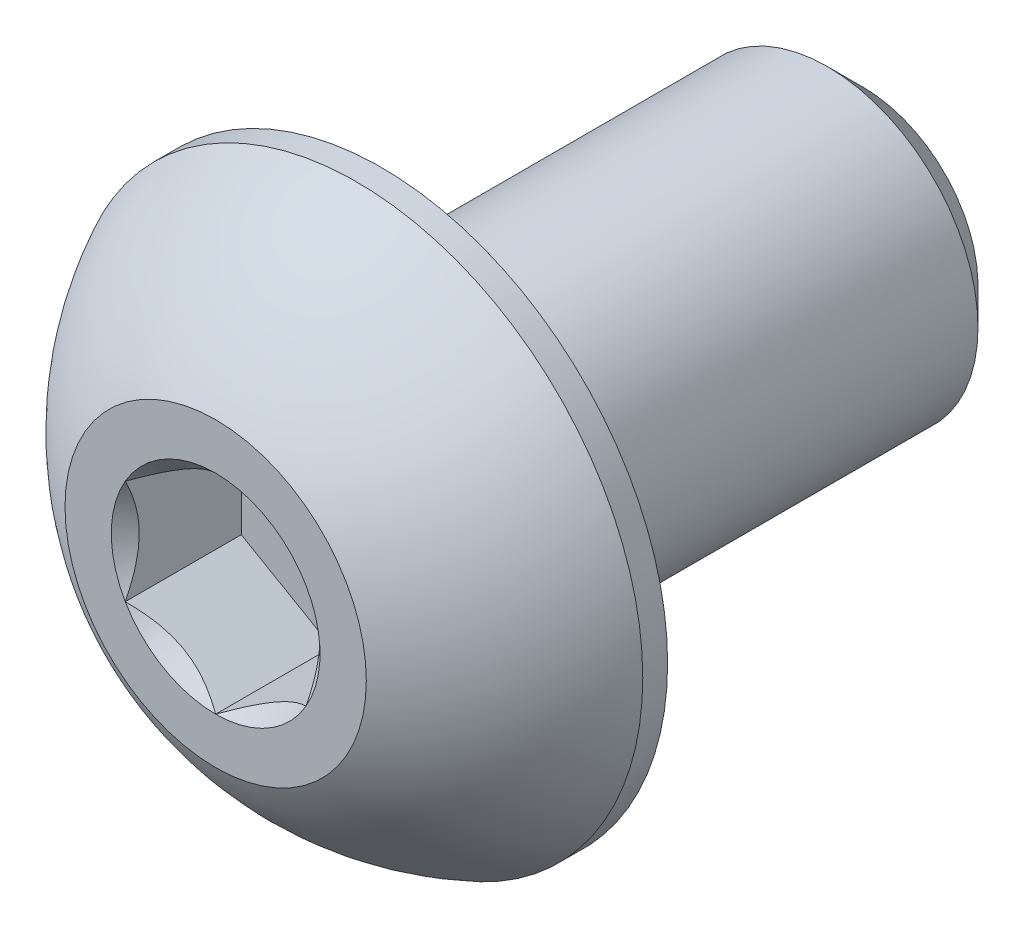
ISO-10303-21;
HEADER;
FILE_DESCRIPTION(('STEP AP214'),'2;1');
FILE_NAME('part.step','',(''),(''),'','','');
FILE_SCHEMA(('AUTOMOTIVE_DESIGN { 1 0 10303 214 1 1 1 1 }'));
ENDSEC;
DATA;
#1=APPLICATION_CONTEXT('core data for automotive mechanical design processes');
#2=APPLICATION_PROTOCOL_DEFINITION('international standard','automotive_design',2000,#1);
#3=PRODUCT_CONTEXT('',#1,'mechanical');
#4=PRODUCT('Part','Part','',(#3));
#5=PRODUCT_RELATED_PRODUCT_CATEGORY('part','',(#4));
#6=PRODUCT_DEFINITION_FORMATION('','',#4);
#7=PRODUCT_DEFINITION_CONTEXT('part definition',#1,'design');
#8=PRODUCT_DEFINITION('design','',#6,#7);
#9=PRODUCT_DEFINITION_SHAPE('','',#8);
#10=(LENGTH_UNIT() NAMED_UNIT(*) SI_UNIT(.MILLI.,.METRE.));
#11=(NAMED_UNIT(*) PLANE_ANGLE_UNIT() SI_UNIT($,.RADIAN.));
#12=(NAMED_UNIT(*) SI_UNIT($,.STERADIAN.) SOLID_ANGLE_UNIT());
#13=UNCERTAINTY_MEASURE_WITH_UNIT(LENGTH_MEASURE(1.E-05),#10,'distance_accuracy_value','');
#14=(GEOMETRIC_REPRESENTATION_CONTEXT(3) GLOBAL_UNCERTAINTY_ASSIGNED_CONTEXT((#13)) GLOBAL_UNIT_ASSIGNED_CONTEXT((#10,
#11,#12)) REPRESENTATION_CONTEXT('',''));
#15=CARTESIAN_POINT('',(0.,0.,0.));
#16=DIRECTION('',(0.,0.,1.));
#17=DIRECTION('',(1.,0.,0.));
#18=AXIS2_PLACEMENT_3D('',#15,#16,#17);
#19=CARTESIAN_POINT('',(0.,-2.50000000000001,-10.75));
#20=DIRECTION('',(0.,0.,-1.));
#21=DIRECTION('',(0.,1.,0.));
#22=AXIS2_PLACEMENT_3D('',#19,#20,#21);
#23=PLANE('',#22);
#24=CARTESIAN_POINT('',(0.,0.,-10.75));
#25=DIRECTION('',(0.,0.,-1.));
#26=DIRECTION('',(0.,1.,0.));
#27=AXIS2_PLACEMENT_3D('',#24,#25,#26);
#28=CIRCLE('',#27,1.90000000000001);
#29=CARTESIAN_POINT('',(0.,1.90000000000001,-10.75));
#30=VERTEX_POINT('',#29);
#31=EDGE_CURVE('E174',#30,#30,#28,.T.);
#32=ORIENTED_EDGE('',*,*,#31,.T.);
#33=EDGE_LOOP('',(#32));
#34=FACE_BOUND('',#33,.T.);
#35=ADVANCED_FACE('F34',(#34),#23,.T.);
#36=CARTESIAN_POINT('',(0.,0.,-10.75));
#37=DIRECTION('',(0.,0.,-1.));
#38=DIRECTION('',(0.,1.,0.));
#39=AXIS2_PLACEMENT_3D('',#36,#37,#38);
#40=CYLINDRICAL_SURFACE('',#39,2.5);
#41=CARTESIAN_POINT('',(0.,0.,-10.15));
#42=DIRECTION('',(0.,0.,-1.));
#43=DIRECTION('',(0.,1.,0.));
#44=AXIS2_PLACEMENT_3D('',#41,#42,#43);
#45=CIRCLE('',#44,2.5);
#46=CARTESIAN_POINT('',(0.,2.5,-10.15));
#47=VERTEX_POINT('',#46);
#48=EDGE_CURVE('E48',#47,#47,#45,.F.);
#49=ORIENTED_EDGE('',*,*,#48,.T.);
#50=EDGE_LOOP('',(#49));
#51=FACE_BOUND('',#50,.T.);
#52=CARTESIAN_POINT('',(0.,0.,-2.75));
#53=DIRECTION('',(0.,0.,1.));
#54=DIRECTION('',(1.,0.,0.));
#55=AXIS2_PLACEMENT_3D('',#52,#53,#54);
#56=CIRCLE('',#55,2.5);
#57=CARTESIAN_POINT('',(2.5,0.,-2.75));
#58=VERTEX_POINT('',#57);
#59=EDGE_CURVE('E171',#58,#58,#56,.F.);
#60=ORIENTED_EDGE('',*,*,#59,.T.);
#61=EDGE_LOOP('',(#60));
#62=FACE_BOUND('',#61,.T.);
#63=ADVANCED_FACE('F179',(#51,#62),#40,.T.);
#64=CARTESIAN_POINT('',(0.,0.,-10.75));
#65=DIRECTION('',(0.,0.,1.));
#66=DIRECTION('',(0.,-1.,0.));
#67=AXIS2_PLACEMENT_3D('',#64,#65,#66);
#68=CONICAL_SURFACE('',#67,1.90000000000001,0.785398163397447);
#69=ORIENTED_EDGE('',*,*,#48,.F.);
#70=EDGE_LOOP('',(#69));
#71=FACE_BOUND('',#70,.T.);
#72=ORIENTED_EDGE('',*,*,#31,.F.);
#73=EDGE_LOOP('',(#72));
#74=FACE_BOUND('',#73,.T.);
#75=ADVANCED_FACE('F36',(#71,#74),#68,.T.);
#76=CARTESIAN_POINT('',(0.,0.,-4.65805481283422));
#77=DIRECTION('',(0.,0.,1.));
#78=DIRECTION('',(0.,-1.,0.));
#79=AXIS2_PLACEMENT_3D('',#76,#77,#78);
#80=SPHERICAL_SURFACE('',#79,5.28653711226622);
#81=CARTESIAN_POINT('',(0.,0.,0.));
#82=DIRECTION('',(0.,0.,1.));
#83=DIRECTION('',(1.,0.,0.));
#84=AXIS2_PLACEMENT_3D('',#81,#82,#83);
#85=CIRCLE('',#84,2.5);
#86=CARTESIAN_POINT('',(0.,-2.50000000000001,0.));
#87=VERTEX_POINT('',#86);
#88=EDGE_CURVE('E168',#87,#87,#85,.T.);
#89=CARTESIAN_POINT('',(0.,0.,-2.3375));
#90=DIRECTION('',(0.,0.,1.));
#91=DIRECTION('',(1.,0.,0.));
#92=AXIS2_PLACEMENT_3D('',#89,#90,#91);
#93=CIRCLE('',#92,4.75);
#94=CARTESIAN_POINT('',(0.,-4.75,-2.3375));
#95=VERTEX_POINT('',#94);
#96=EDGE_CURVE('E162',#95,#95,#93,.T.);
#97=CARTESIAN_POINT('',(0.,-2.50000000000001,0.));
#98=CARTESIAN_POINT('',(0.,-2.53026679982018,-0.0162442824556099));
#99=CARTESIAN_POINT('',(0.,-2.56037522904968,-0.0327836412064137));
#100=CARTESIAN_POINT('',(0.,-2.62026400427658,-0.066446051882188));
#101=CARTESIAN_POINT('',(0.,-2.65004435027397,-0.0835691038071585));
#102=CARTESIAN_POINT('',(0.,-2.70926561698584,-0.118392441415041));
#103=CARTESIAN_POINT('',(0.,-2.73870653770033,-0.136092727097952));
#104=CARTESIAN_POINT('',(0.,-2.79723777417104,-0.172063794044946));
#105=CARTESIAN_POINT('',(0.,-2.82632808992726,-0.190334575309028));
#106=CARTESIAN_POINT('',(0.,-2.8841470610759,-0.227439694392677));
#107=CARTESIAN_POINT('',(0.,-2.91287571646831,-0.246274032212245));
#108=CARTESIAN_POINT('',(0.,-2.96996045130294,-0.284499106978589));
#109=CARTESIAN_POINT('',(0.,-2.99831653074515,-0.303889843925366));
#110=CARTESIAN_POINT('',(0.,-3.05464533901892,-0.343220349244855));
#111=CARTESIAN_POINT('',(0.,-3.08261806785047,-0.363160117617568));
#112=CARTESIAN_POINT('',(0.,-3.13816954607727,-0.403581109164591));
#113=CARTESIAN_POINT('',(0.,-3.16574829547251,-0.424062332338902));
#114=CARTESIAN_POINT('',(0.,-3.22050133565615,-0.465558451209039));
#115=CARTESIAN_POINT('',(0.,-3.24767562644455,-0.486573346904866));
#116=CARTESIAN_POINT('',(0.,-3.30160942393942,-0.529128825735186));
#117=CARTESIAN_POINT('',(0.,-3.32836893064589,-0.550669408869679));
#118=CARTESIAN_POINT('',(0.,-3.38146299210494,-0.594268077753709));
#119=CARTESIAN_POINT('',(0.,-3.40779754685753,-0.616326163503247));
#120=CARTESIAN_POINT('',(0.,-3.46003169800773,-0.660951456155511));
#121=CARTESIAN_POINT('',(0.,-3.48593129440535,-0.683518663058238));
#122=CARTESIAN_POINT('',(0.,-3.53728568771642,-0.72915362310351));
#123=CARTESIAN_POINT('',(0.,-3.56274048462986,-0.752221376246056));
#124=CARTESIAN_POINT('',(0.,-3.61319560685493,-0.79884866366378));
#125=CARTESIAN_POINT('',(0.,-3.63819593216655,-0.822408197938958));
#126=CARTESIAN_POINT('',(0.,-3.68773261175691,-0.870010095651584));
#127=CARTESIAN_POINT('',(0.,-3.71226896603565,-0.894052459089031));
#128=CARTESIAN_POINT('',(0.,-3.76086838042534,-0.942610879694118));
#129=CARTESIAN_POINT('',(0.,-3.78493144053629,-0.967126936861757));
#130=CARTESIAN_POINT('',(0.,-3.83257512329416,-1.01662342950466));
#131=CARTESIAN_POINT('',(0.,-3.85615574594109,-1.04160386497992));
#132=CARTESIAN_POINT('',(0.,-3.90282559378753,-1.0920196223646));
#133=CARTESIAN_POINT('',(0.,-3.92591481898706,-1.11745494427402));
#134=CARTESIAN_POINT('',(0.,-3.97159309867276,-1.1687708098093));
#135=CARTESIAN_POINT('',(0.,-3.99418215315894,-1.19465135343517));
#136=CARTESIAN_POINT('',(0.,-4.03885150820303,-1.24684782851374));
#137=CARTESIAN_POINT('',(0.,-4.06093180876094,-1.27316375996643));
#138=CARTESIAN_POINT('',(0.,-4.10457526604591,-1.32622101137371));
#139=CARTESIAN_POINT('',(0.,-4.12613842277298,-1.3529623313283));
#140=CARTESIAN_POINT('',(0.,-4.16873939899418,-1.40686019877854));
#141=CARTESIAN_POINT('',(0.,-4.1897772184883,-1.4340167462742));
#142=CARTESIAN_POINT('',(0.,-4.23131952645464,-1.488734750071));
#143=CARTESIAN_POINT('',(0.,-4.25182401492686,-1.51629620637214));
#144=CARTESIAN_POINT('',(0.,-4.29229186971308,-1.5718135551894));
#145=CARTESIAN_POINT('',(0.,-4.31225523602708,-1.59976944770551));
#146=CARTESIAN_POINT('',(0.,-4.35163326096594,-1.65606504649041));
#147=CARTESIAN_POINT('',(0.,-4.3710479195908,-1.6844047527592));
#148=CARTESIAN_POINT('',(0.,-4.40932115213664,-1.74145721073709));
#149=CARTESIAN_POINT('',(0.,-4.42817972605763,-1.77016996244618));
#150=CARTESIAN_POINT('',(0.,-4.46533362339398,-1.82795760128832));
#151=CARTESIAN_POINT('',(0.,-4.48362894680935,-1.85703248842136));
#152=CARTESIAN_POINT('',(0.,-4.51964939166499,-1.91553335033324));
#153=CARTESIAN_POINT('',(0.,-4.53737451310527,-1.94495932511209));
#154=CARTESIAN_POINT('',(0.,-4.57224781803529,-2.00415118173237));
#155=CARTESIAN_POINT('',(0.,-4.58939600152503,-2.03391706357382));
#156=CARTESIAN_POINT('',(0.,-4.62310891815402,-2.09377742234707));
#157=CARTESIAN_POINT('',(0.,-4.63967365129327,-2.12387189927887));
#158=CARTESIAN_POINT('',(0.,-4.67221336026297,-2.18437801974018));
#159=CARTESIAN_POINT('',(0.,-4.68818833609342,-2.21478966326969));
#160=CARTESIAN_POINT('',(0.,-4.71954250823692,-2.27591853680649));
#161=CARTESIAN_POINT('',(0.,-4.73492170454996,-2.30663576681378));
#162=CARTESIAN_POINT('',(0.,-4.75,-2.3375));
#163=B_SPLINE_CURVE_WITH_KNOTS('',3,(#97,#98,#99,#100,#101,#102,#103,#104,#105,#106,#107,#108,
#109,#110,#111,#112,#113,#114,#115,#116,#117,#118,#119,#120,#121,#122,#123,#124,#125,#126,#127,
#128,#129,#130,#131,#132,#133,#134,#135,#136,#137,#138,#139,#140,#141,#142,#143,#144,#145,#146,
#147,#148,#149,#150,#151,#152,#153,#154,#155,#156,#157,#158,#159,#160,#161,#162),.UNSPECIFIED.,
.F.,.F.,(4,2,2,2,2,2,2,2,2,2,2,2,2,2,2,2,2,2,2,2,2,2,2,2,2,2,2,2,2,2,2,2,4),(0.,
0.10304982363783,0.206099647275661,0.309149470913491,0.412199294551321,0.515249118189151,
0.618298941826981,0.721348765464812,0.824398589102642,0.927448412740472,1.0304982363783,
1.13354806001613,1.23659788365396,1.33964770729179,1.44269753092962,1.54574735456745,
1.64879717820528,1.75184700184311,1.85489682548094,1.95794664911877,2.0609964727566,
2.16404629639444,2.26709612003227,2.3701459436701,2.47319576730793,2.57624559094576,
2.67929541458359,2.78234523822142,2.88539506185925,2.98844488549708,3.09149470913491,
3.19454453277274,3.29759435641057),.UNSPECIFIED.);
#164=EDGE_CURVE('BSEAM184',#87,#95,#163,.T.);
#165=ORIENTED_EDGE('',*,*,#88,.F.);
#166=ORIENTED_EDGE('',*,*,#96,.T.);
#167=ORIENTED_EDGE('',*,*,#164,.T.);
#168=ORIENTED_EDGE('',*,*,#164,.F.);
#169=EDGE_LOOP('',(#165,#167,#166,#168));
#170=FACE_BOUND('',#169,.T.);
#171=ADVANCED_FACE('F184',(#170),#80,.T.);
#172=CARTESIAN_POINT('',(0.,-2.5,0.));
#173=DIRECTION('',(0.,0.,-1.));
#174=DIRECTION('',(-1.,0.,0.));
#175=AXIS2_PLACEMENT_3D('',#172,#173,#174);
#176=PLANE('',#175);
#177=CARTESIAN_POINT('',(0.,0.,0.));
#178=DIRECTION('',(0.,0.,1.));
#179=DIRECTION('',(1.,0.,0.));
#180=AXIS2_PLACEMENT_3D('',#177,#178,#179);
#181=CIRCLE('',#180,1.73205080756888);
#182=CARTESIAN_POINT('',(-1.5,0.866025403784438,0.));
#183=VERTEX_POINT('',#182);
#184=CARTESIAN_POINT('',(-1.5,-0.866025403784439,0.));
#185=VERTEX_POINT('',#184);
#186=EDGE_CURVE('E61',#183,#185,#181,.T.);
#187=ORIENTED_EDGE('',*,*,#186,.F.);
#188=CARTESIAN_POINT('',(0.,1.73205080756888,0.));
#189=VERTEX_POINT('',#188);
#190=EDGE_CURVE('E133',#189,#183,#181,.T.);
#191=ORIENTED_EDGE('',*,*,#190,.F.);
#192=CARTESIAN_POINT('',(1.5,0.866025403784439,0.));
#193=VERTEX_POINT('',#192);
#194=EDGE_CURVE('E130',#193,#189,#181,.T.);
#195=ORIENTED_EDGE('',*,*,#194,.F.);
#196=CARTESIAN_POINT('',(1.5,-0.866025403784439,0.));
#197=VERTEX_POINT('',#196);
#198=EDGE_CURVE('E101',#197,#193,#181,.T.);
#199=ORIENTED_EDGE('',*,*,#198,.F.);
#200=CARTESIAN_POINT('',(0.,-1.73205080756888,0.));
#201=VERTEX_POINT('',#200);
#202=EDGE_CURVE('E93',#201,#197,#181,.T.);
#203=ORIENTED_EDGE('',*,*,#202,.F.);
#204=EDGE_CURVE('E54',#185,#201,#181,.T.);
#205=ORIENTED_EDGE('',*,*,#204,.F.);
#206=EDGE_LOOP('',(#187,#191,#195,#199,#203,#205));
#207=FACE_BOUND('',#206,.T.);
#208=ORIENTED_EDGE('',*,*,#88,.T.);
#209=EDGE_LOOP('',(#208));
#210=FACE_BOUND('',#209,.T.);
#211=ADVANCED_FACE('F127',(#207,#210),#176,.F.);
#212=CARTESIAN_POINT('',(0.,-4.75,-2.75));
#213=DIRECTION('',(0.,0.,1.));
#214=DIRECTION('',(1.,0.,0.));
#215=AXIS2_PLACEMENT_3D('',#212,#213,#214);
#216=PLANE('',#215);
#217=ORIENTED_EDGE('',*,*,#59,.F.);
#218=EDGE_LOOP('',(#217));
#219=FACE_BOUND('',#218,.T.);
#220=CARTESIAN_POINT('',(0.,0.,-2.75));
#221=DIRECTION('',(0.,0.,1.));
#222=DIRECTION('',(1.,0.,0.));
#223=AXIS2_PLACEMENT_3D('',#220,#221,#222);
#224=CIRCLE('',#223,4.75);
#225=CARTESIAN_POINT('',(4.75,0.,-2.75));
#226=VERTEX_POINT('',#225);
#227=EDGE_CURVE('E165',#226,#226,#224,.T.);
#228=ORIENTED_EDGE('',*,*,#227,.F.);
#229=EDGE_LOOP('',(#228));
#230=FACE_BOUND('',#229,.T.);
#231=ADVANCED_FACE('F198',(#219,#230),#216,.F.);
#232=CARTESIAN_POINT('',(0.,0.,0.));
#233=DIRECTION('',(0.,0.,1.));
#234=DIRECTION('',(1.,0.,0.));
#235=AXIS2_PLACEMENT_3D('',#232,#233,#234);
#236=CYLINDRICAL_SURFACE('',#235,4.75);
#237=ORIENTED_EDGE('',*,*,#96,.F.);
#238=EDGE_LOOP('',(#237));
#239=FACE_BOUND('',#238,.T.);
#240=ORIENTED_EDGE('',*,*,#227,.T.);
#241=EDGE_LOOP('',(#240));
#242=FACE_BOUND('',#241,.T.);
#243=ADVANCED_FACE('F201',(#239,#242),#236,.T.);
#244=CARTESIAN_POINT('',(0.,0.,0.));
#245=DIRECTION('',(0.,0.,1.));
#246=DIRECTION('',(1.,0.,0.));
#247=AXIS2_PLACEMENT_3D('',#244,#245,#246);
#248=CONICAL_SURFACE('',#247,1.73205080756888,0.78539816339745);
#249=ORIENTED_EDGE('',*,*,#198,.T.);
#250=CARTESIAN_POINT('',(1.5,-1.72720812969692,0.555578516270791));
#251=CARTESIAN_POINT('',(1.5,-1.68515175699268,0.523829907857426));
#252=CARTESIAN_POINT('',(1.5,-1.64286104748673,0.492392593807383));
#253=CARTESIAN_POINT('',(1.5,-1.55771581035942,0.430269087556409));
#254=CARTESIAN_POINT('',(1.5,-1.51486114386668,0.399583085892202));
#255=CARTESIAN_POINT('',(1.5,-1.3846813415127,0.30840719242716));
#256=CARTESIAN_POINT('',(1.5,-1.29637976071654,0.249288343426773));
#257=CARTESIAN_POINT('',(1.5,-1.11121478730467,0.133230996316504));
#258=CARTESIAN_POINT('',(1.5,-1.01415038238167,0.0766095587330078));
#259=CARTESIAN_POINT('',(1.5,-0.815173408897605,-0.0269631187343472));
#260=CARTESIAN_POINT('',(1.5,-0.713278669253285,-0.0739469584583305));
#261=CARTESIAN_POINT('',(1.5,-0.560333774943111,-0.13142733156917));
#262=CARTESIAN_POINT('',(1.5,-0.511547982948042,-0.147924612242751));
#263=CARTESIAN_POINT('',(1.5,-0.412798620136866,-0.177002487072996));
#264=CARTESIAN_POINT('',(1.5,-0.362834968437562,-0.189582811405981));
#265=CARTESIAN_POINT('',(1.5,-0.262863235444982,-0.20996380585323));
#266=CARTESIAN_POINT('',(1.5,-0.212872113808022,-0.21784636725402));
#267=CARTESIAN_POINT('',(1.5,-0.112355243569545,-0.228677936030997));
#268=CARTESIAN_POINT('',(1.5,-0.0618295883726279,-0.231627791475649));
#269=CARTESIAN_POINT('',(1.5,0.037429173332384,-0.23237514227515));
#270=CARTESIAN_POINT('',(1.5,0.0861609672002989,-0.230355266441925));
#271=CARTESIAN_POINT('',(1.5,0.183206937768827,-0.221677447103242));
#272=CARTESIAN_POINT('',(1.5,0.231521073438269,-0.215019053031544));
#273=CARTESIAN_POINT('',(1.5,0.328199853425435,-0.197314755877433));
#274=CARTESIAN_POINT('',(1.5,0.376550616310328,-0.186194188742961));
#275=CARTESIAN_POINT('',(1.5,0.472195697125598,-0.160156585951288));
#276=CARTESIAN_POINT('',(1.5,0.51949010309274,-0.145239867959065));
#277=CARTESIAN_POINT('',(1.5,0.668391282696624,-0.0926647764039276));
#278=CARTESIAN_POINT('',(1.5,0.767878709508552,-0.0490187125280247));
#279=CARTESIAN_POINT('',(1.5,0.962179866690724,0.048022994593097));
#280=CARTESIAN_POINT('',(1.5,1.05697519961444,0.101453665089533));
#281=CARTESIAN_POINT('',(1.5,1.23814273533383,0.211685852004558));
#282=CARTESIAN_POINT('',(1.5,1.3246994218129,0.268187920698596));
#283=CARTESIAN_POINT('',(1.5,1.45222331290673,0.355534301578659));
#284=CARTESIAN_POINT('',(1.5,1.49418091978756,0.384957758680043));
#285=CARTESIAN_POINT('',(1.5,1.57752272931476,0.444582821830463));
#286=CARTESIAN_POINT('',(1.5,1.61890708647354,0.474784211664437));
#287=CARTESIAN_POINT('',(1.5,1.66005278019494,0.505308178609455));
#288=B_SPLINE_CURVE_WITH_KNOTS('',3,(#250,#251,#252,#253,#254,#255,#256,#257,#258,#259,#260,
#261,#262,#263,#264,#265,#266,#267,#268,#269,#270,#271,#272,#273,#274,#275,#276,#277,#278,#279,
#280,#281,#282,#283,#284,#285,#286,#287),.UNSPECIFIED.,.F.,.F.,(4,2,2,2,2,2,2,2,2,2,2,2,2,2,2,2,
2,2,4),(0.,0.158079548982668,0.316198780993942,0.634850417346958,0.97169031136151,
1.30737131660667,1.46173961127089,1.61611853740677,1.7677210142141,1.91929742368538,
2.065387412096,2.21149159305544,2.36014984633872,2.50879566386709,2.83376031422673,
3.15991186985652,3.46985601802197,3.62358896039974,3.7772796264207),.UNSPECIFIED.);
#289=EDGE_CURVE('E11',#197,#193,#288,.T.);
#290=ORIENTED_EDGE('',*,*,#289,.F.);
#291=EDGE_LOOP('',(#249,#290));
#292=FACE_BOUND('',#291,.T.);
#293=ADVANCED_FACE('F105',(#292),#248,.F.);
#294=ORIENTED_EDGE('',*,*,#194,.T.);
#295=CARTESIAN_POINT('',(1.5002,0.865909933730601,0.000115481600073358));
#296=CARTESIAN_POINT('',(1.44863220926292,0.895682611594166,-0.0296345239326722));
#297=CARTESIAN_POINT('',(1.3962020823348,0.925953159489765,-0.0576375160896872));
#298=CARTESIAN_POINT('',(1.2892909659444,0.987678321317123,-0.108910769559857));
#299=CARTESIAN_POINT('',(1.23479980418534,1.01913880822717,-0.132152494955627));
#300=CARTESIAN_POINT('',(1.12492091864275,1.08257741237344,-0.17196627100778));
#301=CARTESIAN_POINT('',(1.0695611909048,1.11453936608521,-0.188638414329103));
#302=CARTESIAN_POINT('',(0.95762274252285,1.1791670593912,-0.214325543181896));
#303=CARTESIAN_POINT('',(0.901047443446992,1.21183082354213,-0.223359709521134));
#304=CARTESIAN_POINT('',(0.80354461048356,1.26812411040032,-0.231510918773148));
#305=CARTESIAN_POINT('',(0.762743091719534,1.29168087824208,-0.232717747010784));
#306=CARTESIAN_POINT('',(0.681212030384142,1.33875285845138,-0.230685942837733));
#307=CARTESIAN_POINT('',(0.64048250568537,1.36226806050018,-0.227446329251693));
#308=CARTESIAN_POINT('',(0.559415597836584,1.40907206156905,-0.216708014018038));
#309=CARTESIAN_POINT('',(0.519078615401712,1.43236062923612,-0.209205346981267));
#310=CARTESIAN_POINT('',(0.43908166308597,1.47854689118996,-0.19034838807171));
#311=CARTESIAN_POINT('',(0.399421991483793,1.50144441326545,-0.178992442981415));
#312=CARTESIAN_POINT('',(0.297836865225515,1.56009461325633,-0.145278352407329));
#313=CARTESIAN_POINT('',(0.236541446290311,1.59548353987866,-0.120378150906633));
#314=CARTESIAN_POINT('',(0.146414371536687,1.64751843074894,-0.078343346728424));
#315=CARTESIAN_POINT('',(0.116714860092282,1.66466545167617,-0.0635748464409041));
#316=CARTESIAN_POINT('',(0.0578620986162489,1.69864410935691,-0.0326894340598314));
#317=CARTESIAN_POINT('',(0.0287085957793626,1.71547589206761,-0.0165731658782897));
#318=CARTESIAN_POINT('',(-0.000200000000000189,1.73216627762271,0.000115481600073298));
#319=B_SPLINE_CURVE_WITH_KNOTS('',3,(#295,#296,#297,#298,#299,#300,#301,#302,#303,#304,#305,
#306,#307,#308,#309,#310,#311,#312,#313,#314,#315,#316,#317,#318),.UNSPECIFIED.,.F.,.F.,(4,2,2,
2,2,2,2,2,2,2,2,4),(0.,0.199829143693305,0.400822987382388,0.59862372053818,0.795926240188888,
0.93711306795988,1.07833105577193,1.21968061668222,1.36109089931054,1.58570969637565,
1.69770705470964,1.80965120737194),.UNSPECIFIED.);
#320=EDGE_CURVE('E132',#193,#189,#319,.T.);
#321=ORIENTED_EDGE('',*,*,#320,.F.);
#322=EDGE_LOOP('',(#294,#321));
#323=FACE_BOUND('',#322,.T.);
#324=ADVANCED_FACE('F286',(#323),#248,.F.);
#325=ORIENTED_EDGE('',*,*,#190,.T.);
#326=CARTESIAN_POINT('',(0.000199999999999634,1.73216627762272,0.000115481600073681));
#327=CARTESIAN_POINT('',(-0.0513677907370761,1.70239359975915,-0.029634523932672));
#328=CARTESIAN_POINT('',(-0.103797917665201,1.67212305186355,-0.0576375160896873));
#329=CARTESIAN_POINT('',(-0.210709034055597,1.61039789003619,-0.108910769559858));
#330=CARTESIAN_POINT('',(-0.265200195814661,1.57893740312614,-0.132152494955627));
#331=CARTESIAN_POINT('',(-0.375079081357249,1.51549879897987,-0.17196627100778));
#332=CARTESIAN_POINT('',(-0.4304388090952,1.4835368452681,-0.188638414329104));
#333=CARTESIAN_POINT('',(-0.542377257477151,1.41890915196211,-0.214325543181897));
#334=CARTESIAN_POINT('',(-0.598952556553009,1.38624538781118,-0.223359709521134));
#335=CARTESIAN_POINT('',(-0.696455389516441,1.32995210095299,-0.231510918773148));
#336=CARTESIAN_POINT('',(-0.737256908280467,1.30639533311124,-0.232717747010783));
#337=CARTESIAN_POINT('',(-0.818787969615859,1.25932335290193,-0.230685942837733));
#338=CARTESIAN_POINT('',(-0.859517494314631,1.23580815085313,-0.227446329251693));
#339=CARTESIAN_POINT('',(-0.940584402163417,1.18900414978427,-0.216708014018038));
#340=CARTESIAN_POINT('',(-0.980921384598289,1.16571558211719,-0.209205346981267));
#341=CARTESIAN_POINT('',(-1.06091833691403,1.11952932016335,-0.19034838807171));
#342=CARTESIAN_POINT('',(-1.10057800851621,1.09663179808786,-0.178992442981415));
#343=CARTESIAN_POINT('',(-1.20216313477449,1.03798159809698,-0.145278352407329));
#344=CARTESIAN_POINT('',(-1.26345855370969,1.00259267147465,-0.120378150906633));
#345=CARTESIAN_POINT('',(-1.35358562846331,0.950557780604374,-0.0783433467284239));
#346=CARTESIAN_POINT('',(-1.38328513990772,0.933410759677147,-0.0635748464409042));
#347=CARTESIAN_POINT('',(-1.44213790138375,0.899432101996406,-0.0326894340598318));
#348=CARTESIAN_POINT('',(-1.47129140422064,0.882600319285709,-0.0165731658782901));
#349=CARTESIAN_POINT('',(-1.5002,0.8659099337306,0.000115481600073071));
#350=B_SPLINE_CURVE_WITH_KNOTS('',3,(#326,#327,#328,#329,#330,#331,#332,#333,#334,#335,#336,
#337,#338,#339,#340,#341,#342,#343,#344,#345,#346,#347,#348,#349),.UNSPECIFIED.,.F.,.F.,(4,2,2,
2,2,2,2,2,2,2,2,4),(0.,0.199829143693305,0.400822987382389,0.598623720538181,0.79592624018889,
0.937113067959882,1.07833105577193,1.21968061668222,1.36109089931055,1.58570969637566,
1.69770705470964,1.80965120737194),.UNSPECIFIED.);
#351=EDGE_CURVE('E137',#189,#183,#350,.T.);
#352=ORIENTED_EDGE('',*,*,#351,.F.);
#353=EDGE_LOOP('',(#325,#352));
#354=FACE_BOUND('',#353,.T.);
#355=ADVANCED_FACE('F140',(#354),#248,.F.);
#356=ORIENTED_EDGE('',*,*,#186,.T.);
#357=CARTESIAN_POINT('',(-1.5,-1.72720812994822,0.555578516460528));
#358=CARTESIAN_POINT('',(-1.5,-1.68515175723693,0.523829908039856));
#359=CARTESIAN_POINT('',(-1.5,-1.64286104772391,0.492392593982516));
#360=CARTESIAN_POINT('',(-1.5,-1.55771581058238,0.430269087716991));
#361=CARTESIAN_POINT('',(-1.5,-1.5148611440825,0.39958308604553));
#362=CARTESIAN_POINT('',(-1.5,-1.38468134170665,0.308407192558587));
#363=CARTESIAN_POINT('',(-1.5,-1.29637976089561,0.249288343543661));
#364=CARTESIAN_POINT('',(-1.5,-1.11121478745132,0.133230996403487));
#365=CARTESIAN_POINT('',(-1.5,-1.01415038251068,0.0766095588047338));
#366=CARTESIAN_POINT('',(-1.5,-0.815173408989816,-0.0269631186909052));
#367=CARTESIAN_POINT('',(-1.5,-0.713278669326361,-0.0739469584279351));
#368=CARTESIAN_POINT('',(-1.5,-0.56033377500179,-0.131427331548458));
#369=CARTESIAN_POINT('',(-1.5,-0.51154798301275,-0.147924612221661));
#370=CARTESIAN_POINT('',(-1.5,-0.412798620213829,-0.17700248705237));
#371=CARTESIAN_POINT('',(-1.5,-0.362834968520751,-0.189582811386198));
#372=CARTESIAN_POINT('',(-1.5,-0.262863235540417,-0.209963805836543));
#373=CARTESIAN_POINT('',(-1.5,-0.212872113909476,-0.21784636723955));
#374=CARTESIAN_POINT('',(-1.5,-0.112355243682833,-0.228677936022322));
#375=CARTESIAN_POINT('',(-1.5,-0.0618295884917315,-0.231627791470552));
#376=CARTESIAN_POINT('',(-1.5,0.0374291732025489,-0.232375142278223));
#377=CARTESIAN_POINT('',(-1.5,0.0861609670655337,-0.23035526644952));
#378=CARTESIAN_POINT('',(-1.5,0.183206937624695,-0.221677447120588));
#379=CARTESIAN_POINT('',(-1.5,0.2315210732897,-0.215019053054117));
#380=CARTESIAN_POINT('',(-1.5,0.328199853268108,-0.197314755910963));
#381=CARTESIAN_POINT('',(-1.5,0.376550616148692,-0.186194188782254));
#382=CARTESIAN_POINT('',(-1.5,0.47219569695576,-0.160156586002233));
#383=CARTESIAN_POINT('',(-1.5,0.519490102919009,-0.145239868015899));
#384=CARTESIAN_POINT('',(-1.5,0.668391282485063,-0.0926647764885235));
#385=CARTESIAN_POINT('',(-1.5,0.767878709264951,-0.0490187126381633));
#386=CARTESIAN_POINT('',(-1.5,0.9621798663855,0.0480229944290594));
#387=CARTESIAN_POINT('',(-1.5,1.05697519927965,0.101453664897119));
#388=CARTESIAN_POINT('',(-1.5,1.23814273494588,0.211685851757829));
#389=CARTESIAN_POINT('',(-1.5,1.32469942140117,0.268187920426179));
#390=CARTESIAN_POINT('',(-1.5,1.45222331245985,0.355534301267841));
#391=CARTESIAN_POINT('',(-1.5,1.49418091932912,0.384957758356527));
#392=CARTESIAN_POINT('',(-1.5,1.5775227288333,0.444582821481566));
#393=CARTESIAN_POINT('',(-1.5,1.6189070859806,0.474784211302857));
#394=CARTESIAN_POINT('',(-1.5,1.66005277969054,0.505308178235208));
#395=B_SPLINE_CURVE_WITH_KNOTS('',3,(#357,#358,#359,#360,#361,#362,#363,#364,#365,#366,#367,
#368,#369,#370,#371,#372,#373,#374,#375,#376,#377,#378,#379,#380,#381,#382,#383,#384,#385,#386,
#387,#388,#389,#390,#391,#392,#393,#394),.UNSPECIFIED.,.F.,.F.,(4,2,2,2,2,2,2,2,2,2,2,2,2,2,2,2,
2,2,4),(0.,0.158079549012758,0.316198781054129,0.634850417468465,0.971690311551781,
1.30737131686505,1.46173961151184,1.61611853763032,1.76772101442095,1.91929742387554,
2.06538741227089,2.21149159321503,2.36014984648185,2.50879566399376,2.83376031423511,
3.15991186974583,3.4698560178094,3.62358896013692,3.77727962610764),.UNSPECIFIED.);
#396=EDGE_CURVE('E144',#183,#185,#395,.F.);
#397=ORIENTED_EDGE('',*,*,#396,.F.);
#398=EDGE_LOOP('',(#356,#397));
#399=FACE_BOUND('',#398,.T.);
#400=ADVANCED_FACE('F280',(#399),#248,.F.);
#401=ORIENTED_EDGE('',*,*,#204,.T.);
#402=CARTESIAN_POINT('',(-1.5002,-0.865909933730601,0.000115481600073575));
#403=CARTESIAN_POINT('',(-1.44863220926292,-0.895682611594166,-0.029634523932672));
#404=CARTESIAN_POINT('',(-1.3962020823348,-0.925953159489765,-0.0576375160896872));
#405=CARTESIAN_POINT('',(-1.2892909659444,-0.987678321317124,-0.108910769559857));
#406=CARTESIAN_POINT('',(-1.23479980418534,-1.01913880822718,-0.132152494955627));
#407=CARTESIAN_POINT('',(-1.12492091864275,-1.08257741237344,-0.17196627100778));
#408=CARTESIAN_POINT('',(-1.0695611909048,-1.11453936608521,-0.188638414329104));
#409=CARTESIAN_POINT('',(-0.957622742522849,-1.1791670593912,-0.214325543181897));
#410=CARTESIAN_POINT('',(-0.901047443446991,-1.21183082354213,-0.223359709521134));
#411=CARTESIAN_POINT('',(-0.803544610483558,-1.26812411040032,-0.231510918773148));
#412=CARTESIAN_POINT('',(-0.762743091719533,-1.29168087824208,-0.232717747010783));
#413=CARTESIAN_POINT('',(-0.681212030384141,-1.33875285845138,-0.230685942837732));
#414=CARTESIAN_POINT('',(-0.640482505685369,-1.36226806050018,-0.227446329251692));
#415=CARTESIAN_POINT('',(-0.559415597836583,-1.40907206156905,-0.216708014018038));
#416=CARTESIAN_POINT('',(-0.519078615401711,-1.43236062923612,-0.209205346981267));
#417=CARTESIAN_POINT('',(-0.439081663085968,-1.47854689118996,-0.190348388071709));
#418=CARTESIAN_POINT('',(-0.399421991483791,-1.50144441326545,-0.178992442981415));
#419=CARTESIAN_POINT('',(-0.297836865225514,-1.56009461325633,-0.145278352407328));
#420=CARTESIAN_POINT('',(-0.23654144629031,-1.59548353987866,-0.120378150906633));
#421=CARTESIAN_POINT('',(-0.146414371536686,-1.64751843074894,-0.0783433467284234));
#422=CARTESIAN_POINT('',(-0.116714860092282,-1.66466545167617,-0.0635748464409035));
#423=CARTESIAN_POINT('',(-0.0578620986162485,-1.69864410935691,-0.0326894340598309));
#424=CARTESIAN_POINT('',(-0.0287085957793622,-1.71547589206761,-0.0165731658782891));
#425=CARTESIAN_POINT('',(0.00020000000000064,-1.73216627762272,0.000115481600073865));
#426=B_SPLINE_CURVE_WITH_KNOTS('',3,(#402,#403,#404,#405,#406,#407,#408,#409,#410,#411,#412,
#413,#414,#415,#416,#417,#418,#419,#420,#421,#422,#423,#424,#425),.UNSPECIFIED.,.F.,.F.,(4,2,2,
2,2,2,2,2,2,2,2,4),(0.,0.199829143693305,0.400822987382389,0.598623720538181,0.79592624018889,
0.937113067959882,1.07833105577193,1.21968061668222,1.36109089931054,1.58570969637566,
1.69770705470964,1.80965120737194),.UNSPECIFIED.);
#427=EDGE_CURVE('E117',#185,#201,#426,.T.);
#428=ORIENTED_EDGE('',*,*,#427,.F.);
#429=EDGE_LOOP('',(#401,#428));
#430=FACE_BOUND('',#429,.T.);
#431=ADVANCED_FACE('F228',(#430),#248,.F.);
#432=ORIENTED_EDGE('',*,*,#202,.T.);
#433=CARTESIAN_POINT('',(-0.000199999999999451,-1.73216627762272,0.000115481600073879));
#434=CARTESIAN_POINT('',(0.0513677907370763,-1.70239359975915,-0.029634523932672));
#435=CARTESIAN_POINT('',(0.103797917665201,-1.67212305186355,-0.0576375160896872));
#436=CARTESIAN_POINT('',(0.210709034055597,-1.61039789003619,-0.108910769559857));
#437=CARTESIAN_POINT('',(0.265200195814662,-1.57893740312614,-0.132152494955627));
#438=CARTESIAN_POINT('',(0.375079081357249,-1.51549879897987,-0.17196627100778));
#439=CARTESIAN_POINT('',(0.4304388090952,-1.4835368452681,-0.188638414329103));
#440=CARTESIAN_POINT('',(0.542377257477151,-1.41890915196211,-0.214325543181896));
#441=CARTESIAN_POINT('',(0.598952556553009,-1.38624538781118,-0.223359709521134));
#442=CARTESIAN_POINT('',(0.696455389516441,-1.32995210095299,-0.231510918773148));
#443=CARTESIAN_POINT('',(0.737256908280467,-1.30639533311124,-0.232717747010783));
#444=CARTESIAN_POINT('',(0.818787969615859,-1.25932335290193,-0.230685942837733));
#445=CARTESIAN_POINT('',(0.85951749431463,-1.23580815085313,-0.227446329251692));
#446=CARTESIAN_POINT('',(0.940584402163416,-1.18900414978427,-0.216708014018038));
#447=CARTESIAN_POINT('',(0.980921384598289,-1.16571558211719,-0.209205346981267));
#448=CARTESIAN_POINT('',(1.06091833691403,-1.11952932016335,-0.19034838807171));
#449=CARTESIAN_POINT('',(1.10057800851621,-1.09663179808786,-0.178992442981415));
#450=CARTESIAN_POINT('',(1.20216313477449,-1.03798159809698,-0.145278352407328));
#451=CARTESIAN_POINT('',(1.26345855370969,-1.00259267147465,-0.120378150906633));
#452=CARTESIAN_POINT('',(1.35358562846331,-0.950557780604374,-0.0783433467284238));
#453=CARTESIAN_POINT('',(1.38328513990772,-0.933410759677147,-0.063574846440904));
#454=CARTESIAN_POINT('',(1.44213790138375,-0.899432101996407,-0.0326894340598316));
#455=CARTESIAN_POINT('',(1.47129140422064,-0.88260031928571,-0.0165731658782899));
#456=CARTESIAN_POINT('',(1.5002,-0.865909933730601,0.000115481600073133));
#457=B_SPLINE_CURVE_WITH_KNOTS('',3,(#433,#434,#435,#436,#437,#438,#439,#440,#441,#442,#443,
#444,#445,#446,#447,#448,#449,#450,#451,#452,#453,#454,#455,#456),.UNSPECIFIED.,.F.,.F.,(4,2,2,
2,2,2,2,2,2,2,2,4),(0.,0.199829143693305,0.400822987382389,0.598623720538181,0.795926240188889,
0.937113067959881,1.07833105577193,1.21968061668222,1.36109089931054,1.58570969637565,
1.69770705470964,1.80965120737194),.UNSPECIFIED.);
#458=EDGE_CURVE('E97',#201,#197,#457,.T.);
#459=ORIENTED_EDGE('',*,*,#458,.F.);
#460=EDGE_LOOP('',(#432,#459));
#461=FACE_BOUND('',#460,.T.);
#462=ADVANCED_FACE('F95',(#461),#248,.F.);
#463=CARTESIAN_POINT('',(1.5,-0.866025403784438,-1.925));
#464=DIRECTION('',(0.,0.,1.));
#465=DIRECTION('',(1.,0.,0.));
#466=AXIS2_PLACEMENT_3D('',#463,#464,#465);
#467=PLANE('',#466);
#468=DIRECTION('',(0.866025403784438,0.5,0.));
#469=VECTOR('',#468,1.);
#470=CARTESIAN_POINT('',(0.,-1.73205080756888,-1.925));
#471=LINE('',#470,#469);
#472=CARTESIAN_POINT('',(0.,-1.73205080756888,-1.925));
#473=VERTEX_POINT('',#472);
#474=CARTESIAN_POINT('',(1.5,-0.866025403784438,-1.925));
#475=VERTEX_POINT('',#474);
#476=EDGE_CURVE('E116',#473,#475,#471,.T.);
#477=ORIENTED_EDGE('',*,*,#476,.T.);
#478=DIRECTION('',(0.,1.,0.));
#479=VECTOR('',#478,1.);
#480=CARTESIAN_POINT('',(1.5,-0.866025403784438,-1.925));
#481=LINE('',#480,#479);
#482=CARTESIAN_POINT('',(1.5,0.866025403784439,-1.925));
#483=VERTEX_POINT('',#482);
#484=EDGE_CURVE('E121',#475,#483,#481,.T.);
#485=ORIENTED_EDGE('',*,*,#484,.T.);
#486=DIRECTION('',(-0.866025403784439,0.5,0.));
#487=VECTOR('',#486,1.);
#488=CARTESIAN_POINT('',(1.5,0.866025403784439,-1.925));
#489=LINE('',#488,#487);
#490=CARTESIAN_POINT('',(0.,1.73205080756888,-1.925));
#491=VERTEX_POINT('',#490);
#492=EDGE_CURVE('E270',#483,#491,#489,.T.);
#493=ORIENTED_EDGE('',*,*,#492,.T.);
#494=DIRECTION('',(-0.866025403784438,-0.5,0.));
#495=VECTOR('',#494,1.);
#496=CARTESIAN_POINT('',(0.,1.73205080756888,-1.925));
#497=LINE('',#496,#495);
#498=CARTESIAN_POINT('',(-1.5,0.866025403784438,-1.925));
#499=VERTEX_POINT('',#498);
#500=EDGE_CURVE('E153',#491,#499,#497,.T.);
#501=ORIENTED_EDGE('',*,*,#500,.T.);
#502=DIRECTION('',(0.,-1.,0.));
#503=VECTOR('',#502,1.);
#504=CARTESIAN_POINT('',(-1.5,0.866025403784438,-1.925));
#505=LINE('',#504,#503);
#506=CARTESIAN_POINT('',(-1.5,-0.866025403784439,-1.925));
#507=VERTEX_POINT('',#506);
#508=EDGE_CURVE('E274',#499,#507,#505,.T.);
#509=ORIENTED_EDGE('',*,*,#508,.T.);
#510=DIRECTION('',(0.866025403784439,-0.5,0.));
#511=VECTOR('',#510,1.);
#512=CARTESIAN_POINT('',(-1.5,-0.866025403784439,-1.925));
#513=LINE('',#512,#511);
#514=EDGE_CURVE('E124',#507,#473,#513,.T.);
#515=ORIENTED_EDGE('',*,*,#514,.T.);
#516=EDGE_LOOP('',(#477,#485,#493,#501,#509,#515));
#517=FACE_BOUND('',#516,.T.);
#518=ADVANCED_FACE('F227',(#517),#467,.T.);
#519=CARTESIAN_POINT('',(1.5,-0.866025403784438,-1.925));
#520=DIRECTION('',(1.,0.,0.));
#521=DIRECTION('',(0.,0.,-1.));
#522=AXIS2_PLACEMENT_3D('',#519,#520,#521);
#523=PLANE('',#522);
#524=DIRECTION('',(0.,0.,1.));
#525=VECTOR('',#524,1.);
#526=CARTESIAN_POINT('',(1.5,-0.866025403784438,-1.925));
#527=LINE('',#526,#525);
#528=EDGE_CURVE('E113',#475,#197,#527,.T.);
#529=ORIENTED_EDGE('',*,*,#528,.T.);
#530=ORIENTED_EDGE('',*,*,#289,.T.);
#531=DIRECTION('',(0.,0.,1.));
#532=VECTOR('',#531,1.);
#533=CARTESIAN_POINT('',(1.5,0.866025403784439,-1.925));
#534=LINE('',#533,#532);
#535=EDGE_CURVE('E123',#483,#193,#534,.T.);
#536=ORIENTED_EDGE('',*,*,#535,.F.);
#537=ORIENTED_EDGE('',*,*,#484,.F.);
#538=EDGE_LOOP('',(#529,#530,#536,#537));
#539=FACE_BOUND('',#538,.T.);
#540=ADVANCED_FACE('F119',(#539),#523,.F.);
#541=CARTESIAN_POINT('',(1.5,0.866025403784439,-1.925));
#542=DIRECTION('',(0.5,0.866025403784439,0.));
#543=DIRECTION('',(-0.866025403784439,0.5,0.));
#544=AXIS2_PLACEMENT_3D('',#541,#542,#543);
#545=PLANE('',#544);
#546=ORIENTED_EDGE('',*,*,#535,.T.);
#547=ORIENTED_EDGE('',*,*,#320,.T.);
#548=DIRECTION('',(0.,0.,1.));
#549=VECTOR('',#548,1.);
#550=CARTESIAN_POINT('',(0.,1.73205080756888,-1.925));
#551=LINE('',#550,#549);
#552=EDGE_CURVE('E149',#491,#189,#551,.T.);
#553=ORIENTED_EDGE('',*,*,#552,.F.);
#554=ORIENTED_EDGE('',*,*,#492,.F.);
#555=EDGE_LOOP('',(#546,#547,#553,#554));
#556=FACE_BOUND('',#555,.T.);
#557=ADVANCED_FACE('F147',(#556),#545,.F.);
#558=CARTESIAN_POINT('',(0.,1.73205080756888,-1.925));
#559=DIRECTION('',(-0.5,0.866025403784438,0.));
#560=DIRECTION('',(-0.866025403784438,-0.5,0.));
#561=AXIS2_PLACEMENT_3D('',#558,#559,#560);
#562=PLANE('',#561);
#563=ORIENTED_EDGE('',*,*,#552,.T.);
#564=ORIENTED_EDGE('',*,*,#351,.T.);
#565=DIRECTION('',(0.,0.,1.));
#566=VECTOR('',#565,1.);
#567=CARTESIAN_POINT('',(-1.5,0.866025403784438,-1.925));
#568=LINE('',#567,#566);
#569=EDGE_CURVE('E155',#499,#183,#568,.T.);
#570=ORIENTED_EDGE('',*,*,#569,.F.);
#571=ORIENTED_EDGE('',*,*,#500,.F.);
#572=EDGE_LOOP('',(#563,#564,#570,#571));
#573=FACE_BOUND('',#572,.T.);
#574=ADVANCED_FACE('F151',(#573),#562,.F.);
#575=CARTESIAN_POINT('',(-1.5,0.866025403784438,-1.925));
#576=DIRECTION('',(-1.,0.,0.));
#577=DIRECTION('',(0.,-1.,0.));
#578=AXIS2_PLACEMENT_3D('',#575,#576,#577);
#579=PLANE('',#578);
#580=ORIENTED_EDGE('',*,*,#569,.T.);
#581=ORIENTED_EDGE('',*,*,#396,.T.);
#582=DIRECTION('',(0.,0.,1.));
#583=VECTOR('',#582,1.);
#584=CARTESIAN_POINT('',(-1.5,-0.866025403784439,-1.925));
#585=LINE('',#584,#583);
#586=EDGE_CURVE('E157',#507,#185,#585,.T.);
#587=ORIENTED_EDGE('',*,*,#586,.F.);
#588=ORIENTED_EDGE('',*,*,#508,.F.);
#589=EDGE_LOOP('',(#580,#581,#587,#588));
#590=FACE_BOUND('',#589,.T.);
#591=ADVANCED_FACE('F249',(#590),#579,.F.);
#592=CARTESIAN_POINT('',(-1.5,-0.866025403784439,-1.925));
#593=DIRECTION('',(-0.5,-0.866025403784439,0.));
#594=DIRECTION('',(0.866025403784439,-0.5,0.));
#595=AXIS2_PLACEMENT_3D('',#592,#593,#594);
#596=PLANE('',#595);
#597=ORIENTED_EDGE('',*,*,#586,.T.);
#598=ORIENTED_EDGE('',*,*,#427,.T.);
#599=DIRECTION('',(0.,0.,1.));
#600=VECTOR('',#599,1.);
#601=CARTESIAN_POINT('',(0.,-1.73205080756888,-1.925));
#602=LINE('',#601,#600);
#603=EDGE_CURVE('E115',#473,#201,#602,.T.);
#604=ORIENTED_EDGE('',*,*,#603,.F.);
#605=ORIENTED_EDGE('',*,*,#514,.F.);
#606=EDGE_LOOP('',(#597,#598,#604,#605));
#607=FACE_BOUND('',#606,.T.);
#608=ADVANCED_FACE('F208',(#607),#596,.F.);
#609=CARTESIAN_POINT('',(0.,-1.73205080756888,-1.925));
#610=DIRECTION('',(0.5,-0.866025403784438,0.));
#611=DIRECTION('',(0.866025403784438,0.5,0.));
#612=AXIS2_PLACEMENT_3D('',#609,#610,#611);
#613=PLANE('',#612);
#614=ORIENTED_EDGE('',*,*,#603,.T.);
#615=ORIENTED_EDGE('',*,*,#458,.T.);
#616=ORIENTED_EDGE('',*,*,#528,.F.);
#617=ORIENTED_EDGE('',*,*,#476,.F.);
#618=EDGE_LOOP('',(#614,#615,#616,#617));
#619=FACE_BOUND('',#618,.T.);
#620=ADVANCED_FACE('F111',(#619),#613,.F.);
#621=CLOSED_SHELL('',(#35,#63,#75,#171,#211,#231,#243,#293,#324,#355,#400,#431,#462,#518,#540,
#557,#574,#591,#608,#620));
#622=MANIFOLD_SOLID_BREP('B2',#621);
#623=ADVANCED_BREP_SHAPE_REPRESENTATION('',(#18,#622),#14);
#624=SHAPE_DEFINITION_REPRESENTATION(#9,#623);
ENDSEC;
END-ISO-10303-21;
